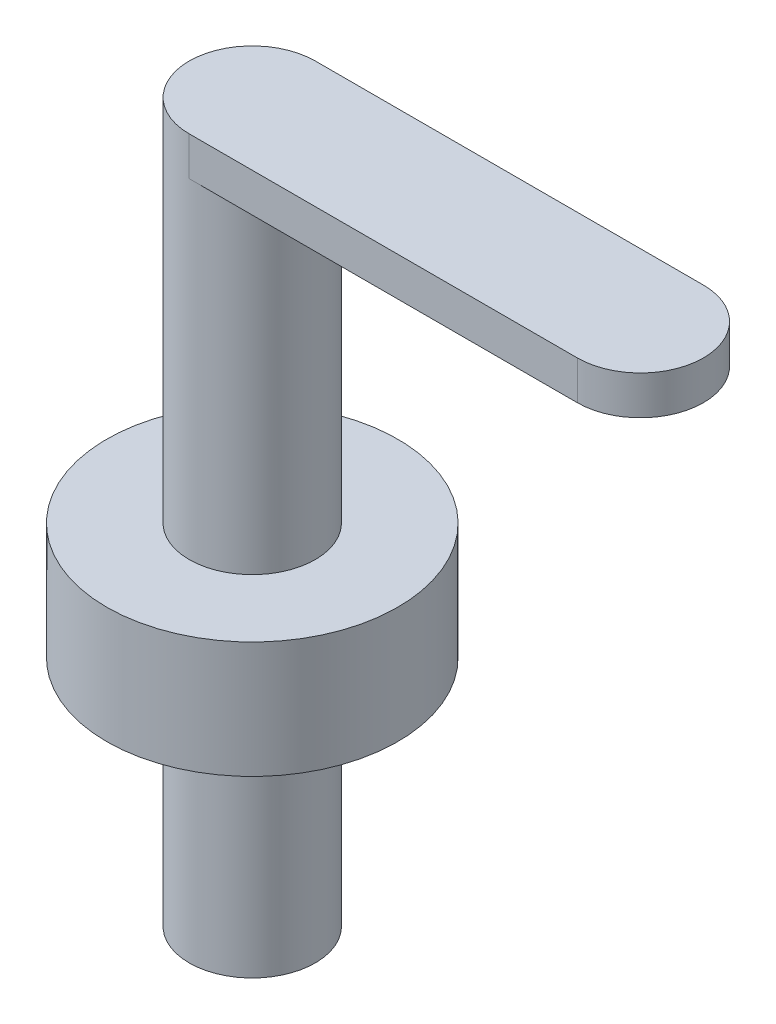
ISO-10303-21;
HEADER;
FILE_DESCRIPTION(('STEP AP214'),'2;1');
FILE_NAME('part.step','',(''),(''),'','','');
FILE_SCHEMA(('AUTOMOTIVE_DESIGN { 1 0 10303 214 1 1 1 1 }'));
ENDSEC;
DATA;
#1=APPLICATION_CONTEXT('core data for automotive mechanical design processes');
#2=APPLICATION_PROTOCOL_DEFINITION('international standard','automotive_design',2000,#1);
#3=PRODUCT_CONTEXT('',#1,'mechanical');
#4=PRODUCT('Part','Part','',(#3));
#5=PRODUCT_RELATED_PRODUCT_CATEGORY('part','',(#4));
#6=PRODUCT_DEFINITION_FORMATION('','',#4);
#7=PRODUCT_DEFINITION_CONTEXT('part definition',#1,'design');
#8=PRODUCT_DEFINITION('design','',#6,#7);
#9=PRODUCT_DEFINITION_SHAPE('','',#8);
#10=(LENGTH_UNIT() NAMED_UNIT(*) SI_UNIT(.MILLI.,.METRE.));
#11=(NAMED_UNIT(*) PLANE_ANGLE_UNIT() SI_UNIT($,.RADIAN.));
#12=(NAMED_UNIT(*) SI_UNIT($,.STERADIAN.) SOLID_ANGLE_UNIT());
#13=UNCERTAINTY_MEASURE_WITH_UNIT(LENGTH_MEASURE(1.E-05),#10,'distance_accuracy_value','');
#14=(GEOMETRIC_REPRESENTATION_CONTEXT(3) GLOBAL_UNCERTAINTY_ASSIGNED_CONTEXT((#13)) GLOBAL_UNIT_ASSIGNED_CONTEXT((#10,
#11,#12)) REPRESENTATION_CONTEXT('',''));
#15=CARTESIAN_POINT('',(0.,0.,0.));
#16=DIRECTION('',(0.,0.,1.));
#17=DIRECTION('',(1.,0.,0.));
#18=AXIS2_PLACEMENT_3D('',#15,#16,#17);
#19=CARTESIAN_POINT('',(0.,-15.,0.));
#20=DIRECTION('',(0.,1.,0.));
#21=DIRECTION('',(0.,0.,1.));
#22=AXIS2_PLACEMENT_3D('',#19,#20,#21);
#23=CYLINDRICAL_SURFACE('',#22,3.25);
#24=CARTESIAN_POINT('',(0.,3.,0.));
#25=DIRECTION('',(0.,1.,0.));
#26=DIRECTION('',(0.,0.,1.));
#27=AXIS2_PLACEMENT_3D('',#24,#25,#26);
#28=CIRCLE('',#27,3.25);
#29=CARTESIAN_POINT('',(0.,3.,3.25));
#30=VERTEX_POINT('',#29);
#31=EDGE_CURVE('E11',#30,#30,#28,.F.);
#32=ORIENTED_EDGE('',*,*,#31,.F.);
#33=EDGE_LOOP('',(#32));
#34=FACE_BOUND('',#33,.T.);
#35=CARTESIAN_POINT('',(0.,20.,0.));
#36=DIRECTION('',(0.,1.,0.));
#37=DIRECTION('',(0.,0.,1.));
#38=AXIS2_PLACEMENT_3D('',#35,#36,#37);
#39=CIRCLE('',#38,3.25);
#40=CARTESIAN_POINT('',(0.,20.,3.25));
#41=VERTEX_POINT('',#40);
#42=CARTESIAN_POINT('',(0.,20.,-3.25));
#43=VERTEX_POINT('',#42);
#44=EDGE_CURVE('E55',#41,#43,#39,.T.);
#45=ORIENTED_EDGE('',*,*,#44,.F.);
#46=DIRECTION('',(0.,-1.,0.));
#47=VECTOR('',#46,1.);
#48=CARTESIAN_POINT('',(0.,22.,3.25));
#49=LINE('',#48,#47);
#50=CARTESIAN_POINT('',(0.,22.,3.25));
#51=VERTEX_POINT('',#50);
#52=EDGE_CURVE('E100',#51,#41,#49,.T.);
#53=ORIENTED_EDGE('',*,*,#52,.F.);
#54=CARTESIAN_POINT('',(0.,22.,0.));
#55=DIRECTION('',(0.,1.,0.));
#56=DIRECTION('',(0.,0.,1.));
#57=AXIS2_PLACEMENT_3D('',#54,#55,#56);
#58=CIRCLE('',#57,3.25);
#59=CARTESIAN_POINT('',(0.,22.,-3.25));
#60=VERTEX_POINT('',#59);
#61=EDGE_CURVE('E94',#60,#51,#58,.T.);
#62=ORIENTED_EDGE('',*,*,#61,.F.);
#63=DIRECTION('',(0.,-1.,0.));
#64=VECTOR('',#63,1.);
#65=CARTESIAN_POINT('',(0.,22.,-3.25));
#66=LINE('',#65,#64);
#67=EDGE_CURVE('E105',#60,#43,#66,.T.);
#68=ORIENTED_EDGE('',*,*,#67,.T.);
#69=EDGE_LOOP('',(#45,#53,#62,#68));
#70=FACE_BOUND('',#69,.T.);
#71=ADVANCED_FACE('F41',(#34,#70),#23,.T.);
#72=CARTESIAN_POINT('',(0.,3.,0.));
#73=DIRECTION('',(0.,1.,0.));
#74=DIRECTION('',(0.,0.,1.));
#75=AXIS2_PLACEMENT_3D('',#72,#73,#74);
#76=PLANE('',#75);
#77=CARTESIAN_POINT('',(0.,3.,0.));
#78=DIRECTION('',(0.,1.,0.));
#79=DIRECTION('',(0.,0.,1.));
#80=AXIS2_PLACEMENT_3D('',#77,#78,#79);
#81=CIRCLE('',#80,7.5);
#82=CARTESIAN_POINT('',(0.,3.,7.5));
#83=VERTEX_POINT('',#82);
#84=EDGE_CURVE('E121',#83,#83,#81,.T.);
#85=ORIENTED_EDGE('',*,*,#84,.T.);
#86=EDGE_LOOP('',(#85));
#87=FACE_BOUND('',#86,.T.);
#88=ORIENTED_EDGE('',*,*,#31,.T.);
#89=EDGE_LOOP('',(#88));
#90=FACE_BOUND('',#89,.T.);
#91=ADVANCED_FACE('F145',(#87,#90),#76,.T.);
#92=CARTESIAN_POINT('',(0.,-3.,0.));
#93=DIRECTION('',(0.,1.,0.));
#94=DIRECTION('',(0.,0.,1.));
#95=AXIS2_PLACEMENT_3D('',#92,#93,#94);
#96=PLANE('',#95);
#97=CARTESIAN_POINT('',(0.,-3.,0.));
#98=DIRECTION('',(0.,1.,0.));
#99=DIRECTION('',(0.,0.,1.));
#100=AXIS2_PLACEMENT_3D('',#97,#98,#99);
#101=CIRCLE('',#100,7.5);
#102=CARTESIAN_POINT('',(0.,-3.,7.5));
#103=VERTEX_POINT('',#102);
#104=EDGE_CURVE('E120',#103,#103,#101,.T.);
#105=ORIENTED_EDGE('',*,*,#104,.F.);
#106=EDGE_LOOP('',(#105));
#107=FACE_BOUND('',#106,.T.);
#108=CARTESIAN_POINT('',(0.,-3.,0.));
#109=DIRECTION('',(0.,1.,0.));
#110=DIRECTION('',(0.,0.,1.));
#111=AXIS2_PLACEMENT_3D('',#108,#109,#110);
#112=CIRCLE('',#111,3.25);
#113=CARTESIAN_POINT('',(0.,-3.,3.25));
#114=VERTEX_POINT('',#113);
#115=EDGE_CURVE('E117',#114,#114,#112,.T.);
#116=ORIENTED_EDGE('',*,*,#115,.T.);
#117=EDGE_LOOP('',(#116));
#118=FACE_BOUND('',#117,.T.);
#119=ADVANCED_FACE('F141',(#107,#118),#96,.F.);
#120=CARTESIAN_POINT('',(0.,3.,0.));
#121=DIRECTION('',(0.,-1.,0.));
#122=DIRECTION('',(0.,0.,-1.));
#123=AXIS2_PLACEMENT_3D('',#120,#121,#122);
#124=CYLINDRICAL_SURFACE('',#123,7.5);
#125=ORIENTED_EDGE('',*,*,#84,.F.);
#126=EDGE_LOOP('',(#125));
#127=FACE_BOUND('',#126,.T.);
#128=ORIENTED_EDGE('',*,*,#104,.T.);
#129=EDGE_LOOP('',(#128));
#130=FACE_BOUND('',#129,.T.);
#131=ADVANCED_FACE('F134',(#127,#130),#124,.T.);
#132=CARTESIAN_POINT('',(0.,-15.,0.));
#133=DIRECTION('',(0.,1.,0.));
#134=DIRECTION('',(0.,0.,1.));
#135=AXIS2_PLACEMENT_3D('',#132,#133,#134);
#136=PLANE('',#135);
#137=CARTESIAN_POINT('',(0.,-15.,0.));
#138=DIRECTION('',(0.,1.,0.));
#139=DIRECTION('',(0.,0.,1.));
#140=AXIS2_PLACEMENT_3D('',#137,#138,#139);
#141=CIRCLE('',#140,3.25);
#142=CARTESIAN_POINT('',(0.,-15.,3.25));
#143=VERTEX_POINT('',#142);
#144=EDGE_CURVE('E48',#143,#143,#141,.T.);
#145=ORIENTED_EDGE('',*,*,#144,.F.);
#146=EDGE_LOOP('',(#145));
#147=FACE_BOUND('',#146,.T.);
#148=ADVANCED_FACE('F132',(#147),#136,.F.);
#149=ORIENTED_EDGE('',*,*,#144,.T.);
#150=EDGE_LOOP('',(#149));
#151=FACE_BOUND('',#150,.T.);
#152=ORIENTED_EDGE('',*,*,#115,.F.);
#153=EDGE_LOOP('',(#152));
#154=FACE_BOUND('',#153,.T.);
#155=ADVANCED_FACE('F129',(#151,#154),#23,.T.);
#156=CARTESIAN_POINT('',(0.,20.,0.));
#157=DIRECTION('',(0.,1.,0.));
#158=DIRECTION('',(0.,0.,1.));
#159=AXIS2_PLACEMENT_3D('',#156,#157,#158);
#160=PLANE('',#159);
#161=DIRECTION('',(1.,0.,0.));
#162=VECTOR('',#161,1.);
#163=CARTESIAN_POINT('',(0.,20.,3.25));
#164=LINE('',#163,#162);
#165=CARTESIAN_POINT('',(20.,20.,3.25));
#166=VERTEX_POINT('',#165);
#167=EDGE_CURVE('E99',#41,#166,#164,.T.);
#168=ORIENTED_EDGE('',*,*,#167,.F.);
#169=ORIENTED_EDGE('',*,*,#44,.T.);
#170=DIRECTION('',(-1.,0.,0.));
#171=VECTOR('',#170,1.);
#172=CARTESIAN_POINT('',(0.,20.,-3.25));
#173=LINE('',#172,#171);
#174=CARTESIAN_POINT('',(20.,20.,-3.25));
#175=VERTEX_POINT('',#174);
#176=EDGE_CURVE('E111',#175,#43,#173,.T.);
#177=ORIENTED_EDGE('',*,*,#176,.F.);
#178=CARTESIAN_POINT('',(20.,20.,0.));
#179=DIRECTION('',(0.,1.,0.));
#180=DIRECTION('',(0.,0.,1.));
#181=AXIS2_PLACEMENT_3D('',#178,#179,#180);
#182=CIRCLE('',#181,3.25);
#183=EDGE_CURVE('E81',#166,#175,#182,.T.);
#184=ORIENTED_EDGE('',*,*,#183,.F.);
#185=EDGE_LOOP('',(#168,#169,#177,#184));
#186=FACE_BOUND('',#185,.T.);
#187=ADVANCED_FACE('F139',(#186),#160,.F.);
#188=CARTESIAN_POINT('',(0.,22.,3.25));
#189=DIRECTION('',(0.,0.,-1.));
#190=DIRECTION('',(-1.,0.,0.));
#191=AXIS2_PLACEMENT_3D('',#188,#189,#190);
#192=PLANE('',#191);
#193=ORIENTED_EDGE('',*,*,#167,.T.);
#194=DIRECTION('',(0.,-1.,0.));
#195=VECTOR('',#194,1.);
#196=CARTESIAN_POINT('',(20.,22.,3.25));
#197=LINE('',#196,#195);
#198=CARTESIAN_POINT('',(20.,22.,3.25));
#199=VERTEX_POINT('',#198);
#200=EDGE_CURVE('E97',#199,#166,#197,.T.);
#201=ORIENTED_EDGE('',*,*,#200,.F.);
#202=DIRECTION('',(1.,0.,0.));
#203=VECTOR('',#202,1.);
#204=CARTESIAN_POINT('',(0.,22.,3.25));
#205=LINE('',#204,#203);
#206=EDGE_CURVE('E89',#51,#199,#205,.T.);
#207=ORIENTED_EDGE('',*,*,#206,.F.);
#208=ORIENTED_EDGE('',*,*,#52,.T.);
#209=EDGE_LOOP('',(#193,#201,#207,#208));
#210=FACE_BOUND('',#209,.T.);
#211=ADVANCED_FACE('F98',(#210),#192,.F.);
#212=CARTESIAN_POINT('',(20.,22.,0.));
#213=DIRECTION('',(0.,-1.,0.));
#214=DIRECTION('',(0.,0.,-1.));
#215=AXIS2_PLACEMENT_3D('',#212,#213,#214);
#216=CYLINDRICAL_SURFACE('',#215,3.25);
#217=ORIENTED_EDGE('',*,*,#183,.T.);
#218=DIRECTION('',(0.,-1.,0.));
#219=VECTOR('',#218,1.);
#220=CARTESIAN_POINT('',(20.,22.,-3.25));
#221=LINE('',#220,#219);
#222=CARTESIAN_POINT('',(20.,22.,-3.25));
#223=VERTEX_POINT('',#222);
#224=EDGE_CURVE('E101',#223,#175,#221,.T.);
#225=ORIENTED_EDGE('',*,*,#224,.F.);
#226=CARTESIAN_POINT('',(20.,22.,0.));
#227=DIRECTION('',(0.,1.,0.));
#228=DIRECTION('',(0.,0.,1.));
#229=AXIS2_PLACEMENT_3D('',#226,#227,#228);
#230=CIRCLE('',#229,3.25);
#231=EDGE_CURVE('E92',#199,#223,#230,.T.);
#232=ORIENTED_EDGE('',*,*,#231,.F.);
#233=ORIENTED_EDGE('',*,*,#200,.T.);
#234=EDGE_LOOP('',(#217,#225,#232,#233));
#235=FACE_BOUND('',#234,.T.);
#236=ADVANCED_FACE('F103',(#235),#216,.T.);
#237=CARTESIAN_POINT('',(0.,22.,-3.25));
#238=DIRECTION('',(0.,0.,1.));
#239=DIRECTION('',(1.,0.,0.));
#240=AXIS2_PLACEMENT_3D('',#237,#238,#239);
#241=PLANE('',#240);
#242=ORIENTED_EDGE('',*,*,#176,.T.);
#243=ORIENTED_EDGE('',*,*,#67,.F.);
#244=DIRECTION('',(-1.,0.,0.));
#245=VECTOR('',#244,1.);
#246=CARTESIAN_POINT('',(0.,22.,-3.25));
#247=LINE('',#246,#245);
#248=EDGE_CURVE('E64',#223,#60,#247,.T.);
#249=ORIENTED_EDGE('',*,*,#248,.F.);
#250=ORIENTED_EDGE('',*,*,#224,.T.);
#251=EDGE_LOOP('',(#242,#243,#249,#250));
#252=FACE_BOUND('',#251,.T.);
#253=ADVANCED_FACE('F155',(#252),#241,.F.);
#254=CARTESIAN_POINT('',(0.,22.,0.));
#255=DIRECTION('',(0.,1.,0.));
#256=DIRECTION('',(0.,0.,1.));
#257=AXIS2_PLACEMENT_3D('',#254,#255,#256);
#258=PLANE('',#257);
#259=ORIENTED_EDGE('',*,*,#61,.T.);
#260=ORIENTED_EDGE('',*,*,#206,.T.);
#261=ORIENTED_EDGE('',*,*,#231,.T.);
#262=ORIENTED_EDGE('',*,*,#248,.T.);
#263=EDGE_LOOP('',(#259,#260,#261,#262));
#264=FACE_BOUND('',#263,.T.);
#265=ADVANCED_FACE('F90',(#264),#258,.T.);
#266=CLOSED_SHELL('',(#71,#91,#119,#131,#148,#155,#187,#211,#236,#253,#265));
#267=MANIFOLD_SOLID_BREP('B2',#266);
#268=ADVANCED_BREP_SHAPE_REPRESENTATION('',(#18,#267),#14);
#269=SHAPE_DEFINITION_REPRESENTATION(#9,#268);
ENDSEC;
END-ISO-10303-21;
